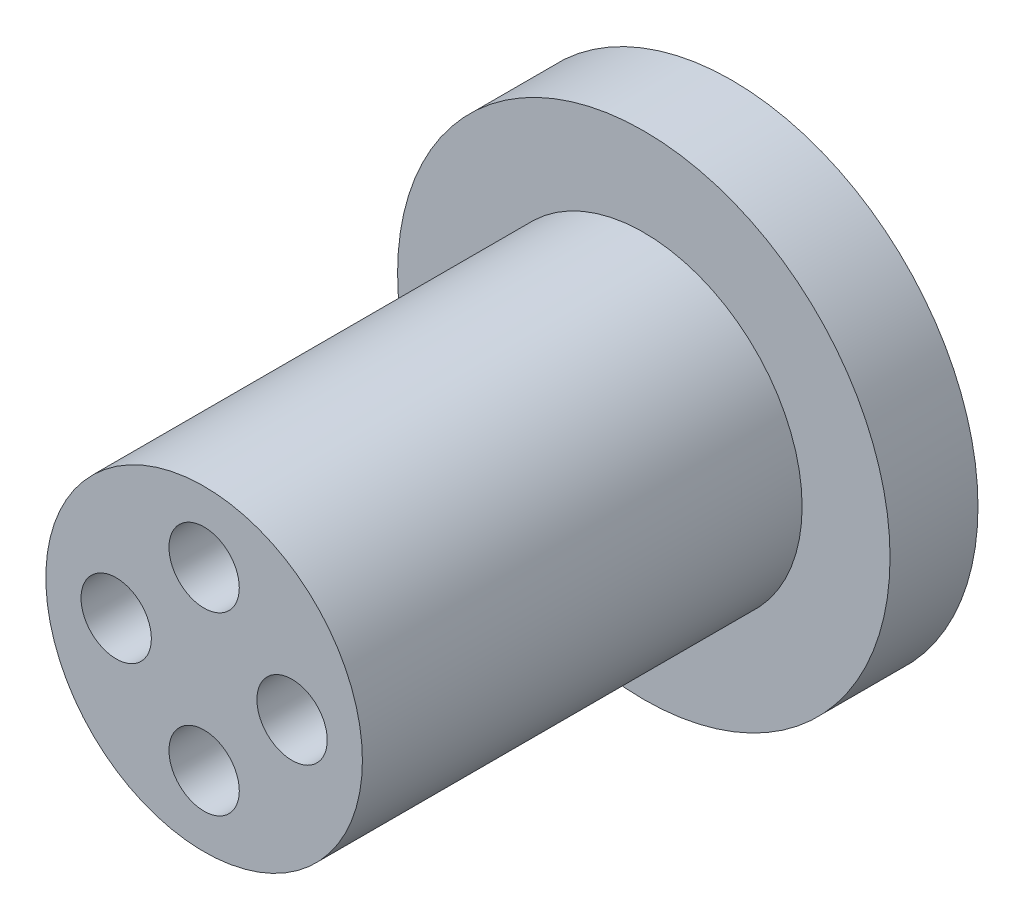
ISO-10303-21;
HEADER;
FILE_DESCRIPTION(('STEP AP214'),'2;1');
FILE_NAME('part.step','',(''),(''),'','','');
FILE_SCHEMA(('AUTOMOTIVE_DESIGN { 1 0 10303 214 1 1 1 1 }'));
ENDSEC;
DATA;
#1=APPLICATION_CONTEXT('core data for automotive mechanical design processes');
#2=APPLICATION_PROTOCOL_DEFINITION('international standard','automotive_design',2000,#1);
#3=PRODUCT_CONTEXT('',#1,'mechanical');
#4=PRODUCT('Part','Part','',(#3));
#5=PRODUCT_RELATED_PRODUCT_CATEGORY('part','',(#4));
#6=PRODUCT_DEFINITION_FORMATION('','',#4);
#7=PRODUCT_DEFINITION_CONTEXT('part definition',#1,'design');
#8=PRODUCT_DEFINITION('design','',#6,#7);
#9=PRODUCT_DEFINITION_SHAPE('','',#8);
#10=(LENGTH_UNIT() NAMED_UNIT(*) SI_UNIT(.MILLI.,.METRE.));
#11=(NAMED_UNIT(*) PLANE_ANGLE_UNIT() SI_UNIT($,.RADIAN.));
#12=(NAMED_UNIT(*) SI_UNIT($,.STERADIAN.) SOLID_ANGLE_UNIT());
#13=UNCERTAINTY_MEASURE_WITH_UNIT(LENGTH_MEASURE(1.E-05),#10,'distance_accuracy_value','');
#14=(GEOMETRIC_REPRESENTATION_CONTEXT(3) GLOBAL_UNCERTAINTY_ASSIGNED_CONTEXT((#13)) GLOBAL_UNIT_ASSIGNED_CONTEXT((#10,
#11,#12)) REPRESENTATION_CONTEXT('',''));
#15=CARTESIAN_POINT('',(0.,0.,0.));
#16=DIRECTION('',(0.,0.,1.));
#17=DIRECTION('',(1.,0.,0.));
#18=AXIS2_PLACEMENT_3D('',#15,#16,#17);
#19=CARTESIAN_POINT('',(0.,0.,2.5));
#20=DIRECTION('',(0.,0.,-1.));
#21=DIRECTION('',(-1.,0.,0.));
#22=AXIS2_PLACEMENT_3D('',#19,#20,#21);
#23=CYLINDRICAL_SURFACE('',#22,7.);
#24=CARTESIAN_POINT('',(0.,0.,2.5));
#25=DIRECTION('',(0.,0.,1.));
#26=DIRECTION('',(1.,0.,0.));
#27=AXIS2_PLACEMENT_3D('',#24,#25,#26);
#28=CIRCLE('',#27,7.);
#29=CARTESIAN_POINT('',(7.,0.,2.5));
#30=VERTEX_POINT('',#29);
#31=EDGE_CURVE('E45',#30,#30,#28,.T.);
#32=ORIENTED_EDGE('',*,*,#31,.F.);
#33=EDGE_LOOP('',(#32));
#34=FACE_BOUND('',#33,.T.);
#35=CARTESIAN_POINT('',(0.,0.,0.));
#36=DIRECTION('',(0.,0.,1.));
#37=DIRECTION('',(1.,0.,0.));
#38=AXIS2_PLACEMENT_3D('',#35,#36,#37);
#39=CIRCLE('',#38,7.);
#40=CARTESIAN_POINT('',(7.,0.,0.));
#41=VERTEX_POINT('',#40);
#42=EDGE_CURVE('E40',#41,#41,#39,.T.);
#43=ORIENTED_EDGE('',*,*,#42,.T.);
#44=EDGE_LOOP('',(#43));
#45=FACE_BOUND('',#44,.T.);
#46=ADVANCED_FACE('F37',(#34,#45),#23,.T.);
#47=CARTESIAN_POINT('',(0.,0.,2.5));
#48=DIRECTION('',(0.,0.,1.));
#49=DIRECTION('',(1.,0.,0.));
#50=AXIS2_PLACEMENT_3D('',#47,#48,#49);
#51=PLANE('',#50);
#52=CARTESIAN_POINT('',(0.,0.,2.5));
#53=DIRECTION('',(0.,0.,1.));
#54=DIRECTION('',(1.,0.,0.));
#55=AXIS2_PLACEMENT_3D('',#52,#53,#54);
#56=CIRCLE('',#55,4.5);
#57=CARTESIAN_POINT('',(4.5,0.,2.5));
#58=VERTEX_POINT('',#57);
#59=EDGE_CURVE('E10',#58,#58,#56,.T.);
#60=ORIENTED_EDGE('',*,*,#59,.F.);
#61=EDGE_LOOP('',(#60));
#62=FACE_BOUND('',#61,.T.);
#63=ORIENTED_EDGE('',*,*,#31,.T.);
#64=EDGE_LOOP('',(#63));
#65=FACE_BOUND('',#64,.T.);
#66=ADVANCED_FACE('F118',(#62,#65),#51,.T.);
#67=CARTESIAN_POINT('',(0.,0.,0.));
#68=DIRECTION('',(0.,0.,1.));
#69=DIRECTION('',(1.,0.,0.));
#70=AXIS2_PLACEMENT_3D('',#67,#68,#69);
#71=PLANE('',#70);
#72=ORIENTED_EDGE('',*,*,#42,.F.);
#73=EDGE_LOOP('',(#72));
#74=FACE_BOUND('',#73,.T.);
#75=ADVANCED_FACE('F113',(#74),#71,.F.);
#76=CARTESIAN_POINT('',(0.,0.,15.));
#77=DIRECTION('',(0.,0.,-1.));
#78=DIRECTION('',(-1.,0.,0.));
#79=AXIS2_PLACEMENT_3D('',#76,#77,#78);
#80=CYLINDRICAL_SURFACE('',#79,4.5);
#81=CARTESIAN_POINT('',(0.,0.,15.));
#82=DIRECTION('',(0.,0.,1.));
#83=DIRECTION('',(1.,0.,0.));
#84=AXIS2_PLACEMENT_3D('',#81,#82,#83);
#85=CIRCLE('',#84,4.5);
#86=CARTESIAN_POINT('',(4.5,0.,15.));
#87=VERTEX_POINT('',#86);
#88=EDGE_CURVE('E52',#87,#87,#85,.T.);
#89=ORIENTED_EDGE('',*,*,#88,.F.);
#90=EDGE_LOOP('',(#89));
#91=FACE_BOUND('',#90,.T.);
#92=ORIENTED_EDGE('',*,*,#59,.T.);
#93=EDGE_LOOP('',(#92));
#94=FACE_BOUND('',#93,.T.);
#95=ADVANCED_FACE('F102',(#91,#94),#80,.T.);
#96=CARTESIAN_POINT('',(0.,0.,15.));
#97=DIRECTION('',(0.,0.,1.));
#98=DIRECTION('',(1.,0.,0.));
#99=AXIS2_PLACEMENT_3D('',#96,#97,#98);
#100=PLANE('',#99);
#101=CARTESIAN_POINT('',(0.,2.5,15.));
#102=DIRECTION('',(0.,0.,1.));
#103=DIRECTION('',(1.,0.,0.));
#104=AXIS2_PLACEMENT_3D('',#101,#102,#103);
#105=CIRCLE('',#104,1.);
#106=CARTESIAN_POINT('',(1.,2.5,15.));
#107=VERTEX_POINT('',#106);
#108=EDGE_CURVE('E81',#107,#107,#105,.T.);
#109=ORIENTED_EDGE('',*,*,#108,.F.);
#110=EDGE_LOOP('',(#109));
#111=FACE_BOUND('',#110,.T.);
#112=CARTESIAN_POINT('',(2.50000000000007,0.,15.));
#113=DIRECTION('',(0.,0.,1.));
#114=DIRECTION('',(1.,0.,0.));
#115=AXIS2_PLACEMENT_3D('',#112,#113,#114);
#116=CIRCLE('',#115,1.);
#117=CARTESIAN_POINT('',(3.50000000000007,0.,15.));
#118=VERTEX_POINT('',#117);
#119=EDGE_CURVE('E73',#118,#118,#116,.T.);
#120=ORIENTED_EDGE('',*,*,#119,.F.);
#121=EDGE_LOOP('',(#120));
#122=FACE_BOUND('',#121,.T.);
#123=CARTESIAN_POINT('',(1.4119006205266E-13,-2.5,15.));
#124=DIRECTION('',(0.,0.,1.));
#125=DIRECTION('',(1.,0.,0.));
#126=AXIS2_PLACEMENT_3D('',#123,#124,#125);
#127=CIRCLE('',#126,1.);
#128=CARTESIAN_POINT('',(1.00000000000014,-2.5,15.));
#129=VERTEX_POINT('',#128);
#130=EDGE_CURVE('E65',#129,#129,#127,.T.);
#131=ORIENTED_EDGE('',*,*,#130,.F.);
#132=EDGE_LOOP('',(#131));
#133=FACE_BOUND('',#132,.T.);
#134=CARTESIAN_POINT('',(-2.49999999999993,0.,15.));
#135=DIRECTION('',(0.,0.,1.));
#136=DIRECTION('',(1.,0.,0.));
#137=AXIS2_PLACEMENT_3D('',#134,#135,#136);
#138=CIRCLE('',#137,1.);
#139=CARTESIAN_POINT('',(-1.49999999999993,0.,15.));
#140=VERTEX_POINT('',#139);
#141=EDGE_CURVE('E57',#140,#140,#138,.T.);
#142=ORIENTED_EDGE('',*,*,#141,.F.);
#143=EDGE_LOOP('',(#142));
#144=FACE_BOUND('',#143,.T.);
#145=ORIENTED_EDGE('',*,*,#88,.T.);
#146=EDGE_LOOP('',(#145));
#147=FACE_BOUND('',#146,.T.);
#148=ADVANCED_FACE('F98',(#111,#122,#133,#144,#147),#100,.T.);
#149=CARTESIAN_POINT('',(-2.49999999999993,0.,10.));
#150=DIRECTION('',(0.,0.,1.));
#151=DIRECTION('',(1.,0.,0.));
#152=AXIS2_PLACEMENT_3D('',#149,#150,#151);
#153=CYLINDRICAL_SURFACE('',#152,1.);
#154=CARTESIAN_POINT('',(-2.49999999999993,0.,10.));
#155=DIRECTION('',(0.,0.,1.));
#156=DIRECTION('',(1.,0.,0.));
#157=AXIS2_PLACEMENT_3D('',#154,#155,#156);
#158=CIRCLE('',#157,1.);
#159=CARTESIAN_POINT('',(-1.49999999999993,0.,10.));
#160=VERTEX_POINT('',#159);
#161=EDGE_CURVE('E61',#160,#160,#158,.T.);
#162=ORIENTED_EDGE('',*,*,#161,.F.);
#163=EDGE_LOOP('',(#162));
#164=FACE_BOUND('',#163,.T.);
#165=ORIENTED_EDGE('',*,*,#141,.T.);
#166=EDGE_LOOP('',(#165));
#167=FACE_BOUND('',#166,.T.);
#168=ADVANCED_FACE('F101',(#164,#167),#153,.F.);
#169=CARTESIAN_POINT('',(-2.49999999999993,0.,10.));
#170=DIRECTION('',(0.,0.,1.));
#171=DIRECTION('',(1.,0.,0.));
#172=AXIS2_PLACEMENT_3D('',#169,#170,#171);
#173=PLANE('',#172);
#174=ORIENTED_EDGE('',*,*,#161,.T.);
#175=EDGE_LOOP('',(#174));
#176=FACE_BOUND('',#175,.T.);
#177=ADVANCED_FACE('F164',(#176),#173,.T.);
#178=CARTESIAN_POINT('',(1.4119006205266E-13,-2.5,10.));
#179=DIRECTION('',(0.,0.,1.));
#180=DIRECTION('',(1.,0.,0.));
#181=AXIS2_PLACEMENT_3D('',#178,#179,#180);
#182=CYLINDRICAL_SURFACE('',#181,1.);
#183=CARTESIAN_POINT('',(1.4119006205266E-13,-2.5,10.));
#184=DIRECTION('',(0.,0.,1.));
#185=DIRECTION('',(1.,0.,0.));
#186=AXIS2_PLACEMENT_3D('',#183,#184,#185);
#187=CIRCLE('',#186,1.);
#188=CARTESIAN_POINT('',(1.00000000000014,-2.5,10.));
#189=VERTEX_POINT('',#188);
#190=EDGE_CURVE('E69',#189,#189,#187,.T.);
#191=ORIENTED_EDGE('',*,*,#190,.F.);
#192=EDGE_LOOP('',(#191));
#193=FACE_BOUND('',#192,.T.);
#194=ORIENTED_EDGE('',*,*,#130,.T.);
#195=EDGE_LOOP('',(#194));
#196=FACE_BOUND('',#195,.T.);
#197=ADVANCED_FACE('F173',(#193,#196),#182,.F.);
#198=CARTESIAN_POINT('',(1.4119006205266E-13,-2.5,10.));
#199=DIRECTION('',(0.,0.,1.));
#200=DIRECTION('',(1.,0.,0.));
#201=AXIS2_PLACEMENT_3D('',#198,#199,#200);
#202=PLANE('',#201);
#203=ORIENTED_EDGE('',*,*,#190,.T.);
#204=EDGE_LOOP('',(#203));
#205=FACE_BOUND('',#204,.T.);
#206=ADVANCED_FACE('F182',(#205),#202,.T.);
#207=CARTESIAN_POINT('',(2.50000000000007,0.,10.));
#208=DIRECTION('',(0.,0.,1.));
#209=DIRECTION('',(1.,0.,0.));
#210=AXIS2_PLACEMENT_3D('',#207,#208,#209);
#211=CYLINDRICAL_SURFACE('',#210,1.);
#212=CARTESIAN_POINT('',(2.50000000000007,0.,10.));
#213=DIRECTION('',(0.,0.,1.));
#214=DIRECTION('',(1.,0.,0.));
#215=AXIS2_PLACEMENT_3D('',#212,#213,#214);
#216=CIRCLE('',#215,1.);
#217=CARTESIAN_POINT('',(3.50000000000007,0.,10.));
#218=VERTEX_POINT('',#217);
#219=EDGE_CURVE('E77',#218,#218,#216,.T.);
#220=ORIENTED_EDGE('',*,*,#219,.F.);
#221=EDGE_LOOP('',(#220));
#222=FACE_BOUND('',#221,.T.);
#223=ORIENTED_EDGE('',*,*,#119,.T.);
#224=EDGE_LOOP('',(#223));
#225=FACE_BOUND('',#224,.T.);
#226=ADVANCED_FACE('F191',(#222,#225),#211,.F.);
#227=CARTESIAN_POINT('',(2.50000000000007,0.,10.));
#228=DIRECTION('',(0.,0.,1.));
#229=DIRECTION('',(1.,0.,0.));
#230=AXIS2_PLACEMENT_3D('',#227,#228,#229);
#231=PLANE('',#230);
#232=ORIENTED_EDGE('',*,*,#219,.T.);
#233=EDGE_LOOP('',(#232));
#234=FACE_BOUND('',#233,.T.);
#235=ADVANCED_FACE('F94',(#234),#231,.T.);
#236=CARTESIAN_POINT('',(0.,2.5,10.));
#237=DIRECTION('',(0.,0.,1.));
#238=DIRECTION('',(1.,0.,0.));
#239=AXIS2_PLACEMENT_3D('',#236,#237,#238);
#240=CYLINDRICAL_SURFACE('',#239,1.);
#241=CARTESIAN_POINT('',(0.,2.5,10.));
#242=DIRECTION('',(0.,0.,1.));
#243=DIRECTION('',(1.,0.,0.));
#244=AXIS2_PLACEMENT_3D('',#241,#242,#243);
#245=CIRCLE('',#244,1.);
#246=CARTESIAN_POINT('',(1.,2.5,10.));
#247=VERTEX_POINT('',#246);
#248=EDGE_CURVE('E56',#247,#247,#245,.T.);
#249=ORIENTED_EDGE('',*,*,#248,.F.);
#250=EDGE_LOOP('',(#249));
#251=FACE_BOUND('',#250,.T.);
#252=ORIENTED_EDGE('',*,*,#108,.T.);
#253=EDGE_LOOP('',(#252));
#254=FACE_BOUND('',#253,.T.);
#255=ADVANCED_FACE('F91',(#251,#254),#240,.F.);
#256=CARTESIAN_POINT('',(0.,2.5,10.));
#257=DIRECTION('',(0.,0.,1.));
#258=DIRECTION('',(1.,0.,0.));
#259=AXIS2_PLACEMENT_3D('',#256,#257,#258);
#260=PLANE('',#259);
#261=ORIENTED_EDGE('',*,*,#248,.T.);
#262=EDGE_LOOP('',(#261));
#263=FACE_BOUND('',#262,.T.);
#264=ADVANCED_FACE('F89',(#263),#260,.T.);
#265=CLOSED_SHELL('',(#46,#66,#75,#95,#148,#168,#177,#197,#206,#226,#235,#255,#264));
#266=MANIFOLD_SOLID_BREP('B2',#265);
#267=ADVANCED_BREP_SHAPE_REPRESENTATION('',(#18,#266),#14);
#268=SHAPE_DEFINITION_REPRESENTATION(#9,#267);
ENDSEC;
END-ISO-10303-21;
